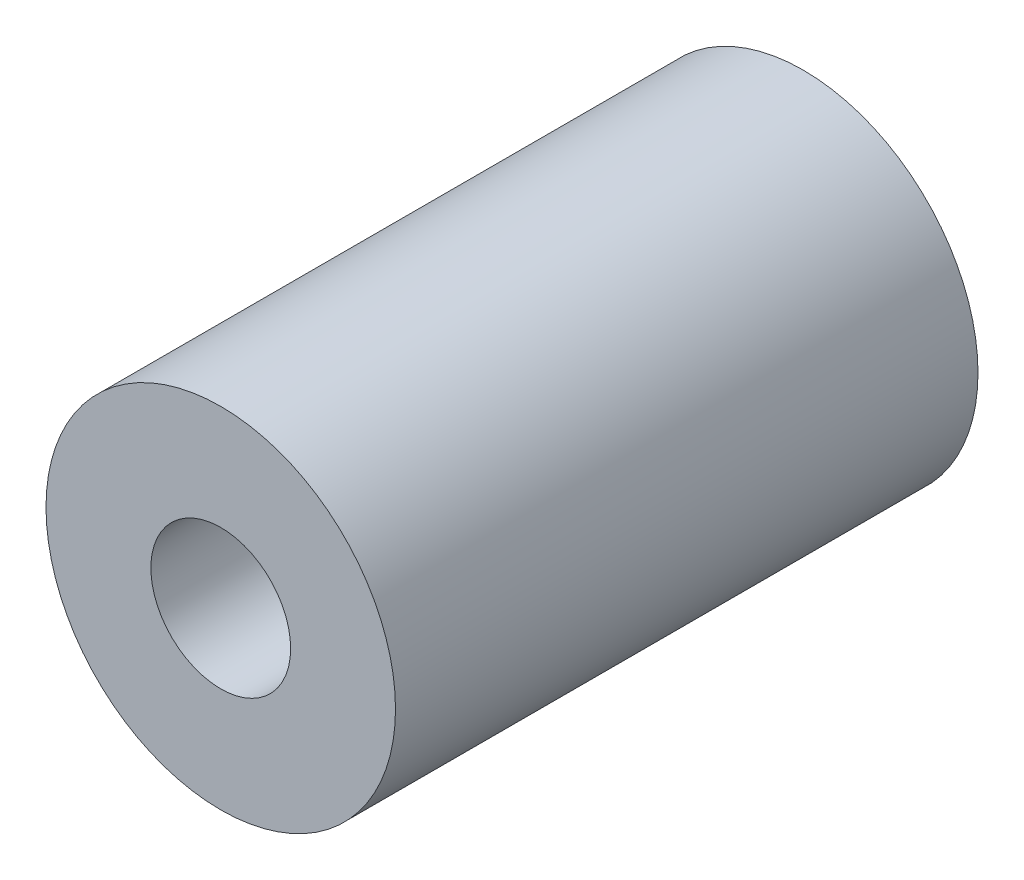
ISO-10303-21;
HEADER;
FILE_DESCRIPTION(('STEP AP214'),'2;1');
FILE_NAME('part.step','',(''),(''),'','','');
FILE_SCHEMA(('AUTOMOTIVE_DESIGN { 1 0 10303 214 1 1 1 1 }'));
ENDSEC;
DATA;
#1=APPLICATION_CONTEXT('core data for automotive mechanical design processes');
#2=APPLICATION_PROTOCOL_DEFINITION('international standard','automotive_design',2000,#1);
#3=PRODUCT_CONTEXT('',#1,'mechanical');
#4=PRODUCT('Part','Part','',(#3));
#5=PRODUCT_RELATED_PRODUCT_CATEGORY('part','',(#4));
#6=PRODUCT_DEFINITION_FORMATION('','',#4);
#7=PRODUCT_DEFINITION_CONTEXT('part definition',#1,'design');
#8=PRODUCT_DEFINITION('design','',#6,#7);
#9=PRODUCT_DEFINITION_SHAPE('','',#8);
#10=(LENGTH_UNIT() NAMED_UNIT(*) SI_UNIT(.MILLI.,.METRE.));
#11=(NAMED_UNIT(*) PLANE_ANGLE_UNIT() SI_UNIT($,.RADIAN.));
#12=(NAMED_UNIT(*) SI_UNIT($,.STERADIAN.) SOLID_ANGLE_UNIT());
#13=UNCERTAINTY_MEASURE_WITH_UNIT(LENGTH_MEASURE(1.E-05),#10,'distance_accuracy_value','');
#14=(GEOMETRIC_REPRESENTATION_CONTEXT(3) GLOBAL_UNCERTAINTY_ASSIGNED_CONTEXT((#13)) GLOBAL_UNIT_ASSIGNED_CONTEXT((#10,
#11,#12)) REPRESENTATION_CONTEXT('',''));
#15=CARTESIAN_POINT('',(0.,0.,0.));
#16=DIRECTION('',(0.,0.,1.));
#17=DIRECTION('',(1.,0.,0.));
#18=AXIS2_PLACEMENT_3D('',#15,#16,#17);
#19=CARTESIAN_POINT('',(0.,0.,50.));
#20=DIRECTION('',(0.,0.,1.));
#21=DIRECTION('',(1.,0.,0.));
#22=AXIS2_PLACEMENT_3D('',#19,#20,#21);
#23=PLANE('',#22);
#24=CARTESIAN_POINT('',(0.,0.,50.));
#25=DIRECTION('',(0.,0.,1.));
#26=DIRECTION('',(1.,0.,0.));
#27=AXIS2_PLACEMENT_3D('',#24,#25,#26);
#28=CIRCLE('',#27,15.);
#29=CARTESIAN_POINT('',(15.,0.,50.));
#30=VERTEX_POINT('',#29);
#31=EDGE_CURVE('E10',#30,#30,#28,.T.);
#32=ORIENTED_EDGE('',*,*,#31,.T.);
#33=EDGE_LOOP('',(#32));
#34=FACE_BOUND('',#33,.T.);
#35=CARTESIAN_POINT('',(0.,0.,50.));
#36=DIRECTION('',(0.,0.,1.));
#37=DIRECTION('',(1.,0.,0.));
#38=AXIS2_PLACEMENT_3D('',#35,#36,#37);
#39=CIRCLE('',#38,6.);
#40=CARTESIAN_POINT('',(6.,0.,50.));
#41=VERTEX_POINT('',#40);
#42=EDGE_CURVE('E56',#41,#41,#39,.T.);
#43=ORIENTED_EDGE('',*,*,#42,.F.);
#44=EDGE_LOOP('',(#43));
#45=FACE_BOUND('',#44,.T.);
#46=ADVANCED_FACE('F45',(#34,#45),#23,.T.);
#47=CARTESIAN_POINT('',(0.,0.,0.));
#48=DIRECTION('',(0.,0.,1.));
#49=DIRECTION('',(1.,0.,0.));
#50=AXIS2_PLACEMENT_3D('',#47,#48,#49);
#51=PLANE('',#50);
#52=CARTESIAN_POINT('',(0.,0.,0.));
#53=DIRECTION('',(0.,0.,1.));
#54=DIRECTION('',(1.,0.,0.));
#55=AXIS2_PLACEMENT_3D('',#52,#53,#54);
#56=CIRCLE('',#55,15.);
#57=CARTESIAN_POINT('',(15.,0.,0.));
#58=VERTEX_POINT('',#57);
#59=EDGE_CURVE('E49',#58,#58,#56,.T.);
#60=ORIENTED_EDGE('',*,*,#59,.F.);
#61=EDGE_LOOP('',(#60));
#62=FACE_BOUND('',#61,.T.);
#63=CARTESIAN_POINT('',(0.,0.,0.));
#64=DIRECTION('',(0.,0.,1.));
#65=DIRECTION('',(1.,0.,0.));
#66=AXIS2_PLACEMENT_3D('',#63,#64,#65);
#67=CIRCLE('',#66,6.);
#68=CARTESIAN_POINT('',(6.,0.,0.));
#69=VERTEX_POINT('',#68);
#70=EDGE_CURVE('E58',#69,#69,#67,.T.);
#71=ORIENTED_EDGE('',*,*,#70,.T.);
#72=EDGE_LOOP('',(#71));
#73=FACE_BOUND('',#72,.T.);
#74=ADVANCED_FACE('F68',(#62,#73),#51,.F.);
#75=CARTESIAN_POINT('',(0.,0.,50.));
#76=DIRECTION('',(0.,0.,-1.));
#77=DIRECTION('',(-1.,0.,0.));
#78=AXIS2_PLACEMENT_3D('',#75,#76,#77);
#79=CYLINDRICAL_SURFACE('',#78,15.);
#80=ORIENTED_EDGE('',*,*,#31,.F.);
#81=EDGE_LOOP('',(#80));
#82=FACE_BOUND('',#81,.T.);
#83=ORIENTED_EDGE('',*,*,#59,.T.);
#84=EDGE_LOOP('',(#83));
#85=FACE_BOUND('',#84,.T.);
#86=ADVANCED_FACE('F47',(#82,#85),#79,.T.);
#87=CARTESIAN_POINT('',(0.,0.,50.));
#88=DIRECTION('',(0.,0.,-1.));
#89=DIRECTION('',(-1.,0.,0.));
#90=AXIS2_PLACEMENT_3D('',#87,#88,#89);
#91=CYLINDRICAL_SURFACE('',#90,6.);
#92=ORIENTED_EDGE('',*,*,#42,.T.);
#93=EDGE_LOOP('',(#92));
#94=FACE_BOUND('',#93,.T.);
#95=ORIENTED_EDGE('',*,*,#70,.F.);
#96=EDGE_LOOP('',(#95));
#97=FACE_BOUND('',#96,.T.);
#98=ADVANCED_FACE('F64',(#94,#97),#91,.F.);
#99=CLOSED_SHELL('',(#46,#74,#86,#98));
#100=MANIFOLD_SOLID_BREP('B2',#99);
#101=ADVANCED_BREP_SHAPE_REPRESENTATION('',(#18,#100),#14);
#102=SHAPE_DEFINITION_REPRESENTATION(#9,#101);
ENDSEC;
END-ISO-10303-21;
